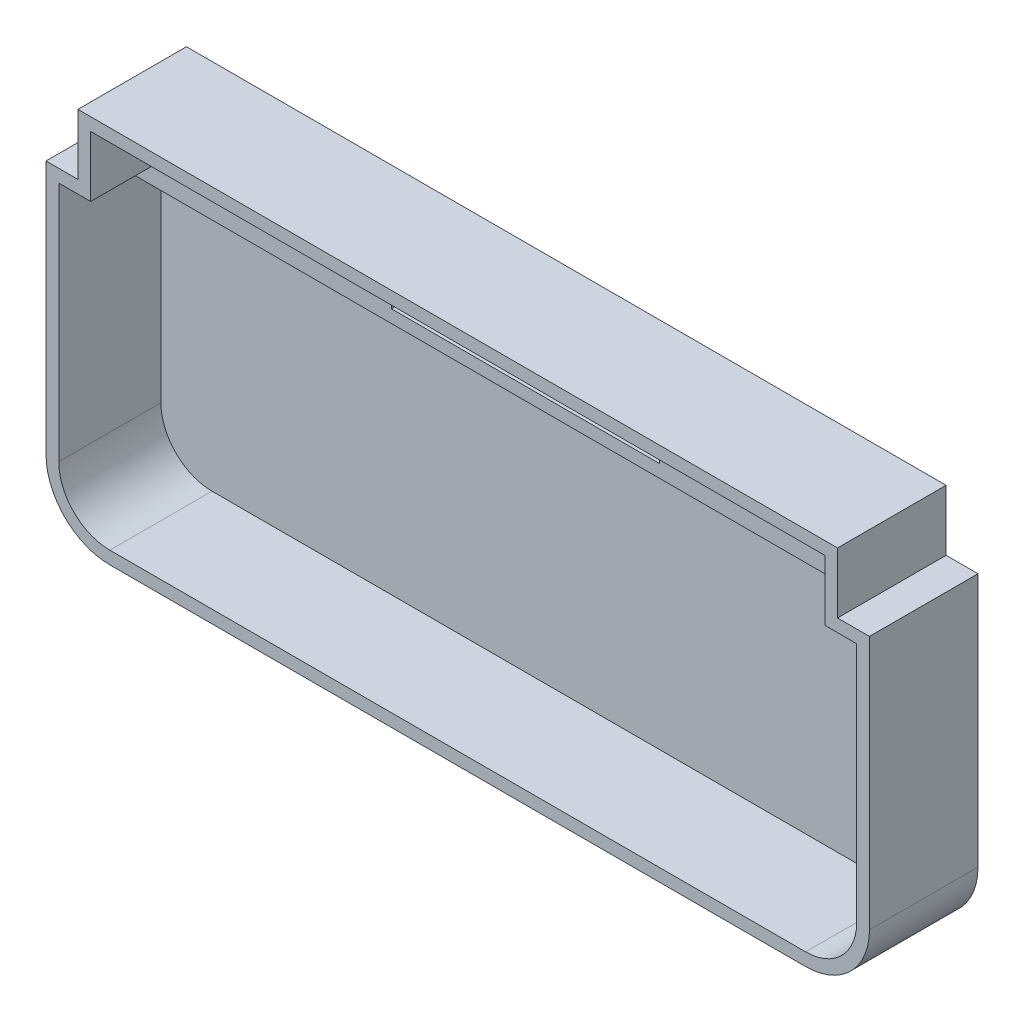
ISO-10303-21;
HEADER;
FILE_DESCRIPTION(('STEP AP214'),'2;1');
FILE_NAME('part.step','',(''),(''),'','','');
FILE_SCHEMA(('AUTOMOTIVE_DESIGN { 1 0 10303 214 1 1 1 1 }'));
ENDSEC;
DATA;
#1=APPLICATION_CONTEXT('core data for automotive mechanical design processes');
#2=APPLICATION_PROTOCOL_DEFINITION('international standard','automotive_design',2000,#1);
#3=PRODUCT_CONTEXT('',#1,'mechanical');
#4=PRODUCT('Part','Part','',(#3));
#5=PRODUCT_RELATED_PRODUCT_CATEGORY('part','',(#4));
#6=PRODUCT_DEFINITION_FORMATION('','',#4);
#7=PRODUCT_DEFINITION_CONTEXT('part definition',#1,'design');
#8=PRODUCT_DEFINITION('design','',#6,#7);
#9=PRODUCT_DEFINITION_SHAPE('','',#8);
#10=(LENGTH_UNIT() NAMED_UNIT(*) SI_UNIT(.MILLI.,.METRE.));
#11=(NAMED_UNIT(*) PLANE_ANGLE_UNIT() SI_UNIT($,.RADIAN.));
#12=(NAMED_UNIT(*) SI_UNIT($,.STERADIAN.) SOLID_ANGLE_UNIT());
#13=UNCERTAINTY_MEASURE_WITH_UNIT(LENGTH_MEASURE(1.E-05),#10,'distance_accuracy_value','');
#14=(GEOMETRIC_REPRESENTATION_CONTEXT(3) GLOBAL_UNCERTAINTY_ASSIGNED_CONTEXT((#13)) GLOBAL_UNIT_ASSIGNED_CONTEXT((#10,
#11,#12)) REPRESENTATION_CONTEXT('',''));
#15=CARTESIAN_POINT('',(0.,0.,0.));
#16=DIRECTION('',(0.,0.,1.));
#17=DIRECTION('',(1.,0.,0.));
#18=AXIS2_PLACEMENT_3D('',#15,#16,#17);
#19=CARTESIAN_POINT('',(62.5,-34.3,17.));
#20=DIRECTION('',(-1.,0.,0.));
#21=DIRECTION('',(0.,0.,1.));
#22=AXIS2_PLACEMENT_3D('',#19,#20,#21);
#23=PLANE('',#22);
#24=DIRECTION('',(0.,1.,0.));
#25=VECTOR('',#24,1.);
#26=CARTESIAN_POINT('',(62.5,3.5,6.5));
#27=LINE('',#26,#25);
#28=CARTESIAN_POINT('',(62.5,0.,6.5));
#29=VERTEX_POINT('',#28);
#30=CARTESIAN_POINT('',(62.5,3.5,6.5));
#31=VERTEX_POINT('',#30);
#32=EDGE_CURVE('E257',#29,#31,#27,.T.);
#33=ORIENTED_EDGE('',*,*,#32,.F.);
#34=DIRECTION('',(0.,0.,-1.));
#35=VECTOR('',#34,1.);
#36=CARTESIAN_POINT('',(62.5,0.,6.5));
#37=LINE('',#36,#35);
#38=CARTESIAN_POINT('',(62.5,0.,1.));
#39=VERTEX_POINT('',#38);
#40=EDGE_CURVE('E292',#29,#39,#37,.T.);
#41=ORIENTED_EDGE('',*,*,#40,.T.);
#42=DIRECTION('',(0.,1.,0.));
#43=VECTOR('',#42,1.);
#44=CARTESIAN_POINT('',(62.5,-34.3,1.));
#45=LINE('',#44,#43);
#46=CARTESIAN_POINT('',(62.5,-34.3,1.));
#47=VERTEX_POINT('',#46);
#48=EDGE_CURVE('E339',#47,#39,#45,.T.);
#49=ORIENTED_EDGE('',*,*,#48,.F.);
#50=DIRECTION('',(0.,0.,-1.));
#51=VECTOR('',#50,1.);
#52=CARTESIAN_POINT('',(62.5,-34.3,17.));
#53=LINE('',#52,#51);
#54=CARTESIAN_POINT('',(62.5,-34.3,17.));
#55=VERTEX_POINT('',#54);
#56=EDGE_CURVE('E373',#55,#47,#53,.T.);
#57=ORIENTED_EDGE('',*,*,#56,.F.);
#58=DIRECTION('',(0.,1.,0.));
#59=VECTOR('',#58,1.);
#60=CARTESIAN_POINT('',(62.5,-34.3,17.));
#61=LINE('',#60,#59);
#62=CARTESIAN_POINT('',(62.5,3.5,17.));
#63=VERTEX_POINT('',#62);
#64=EDGE_CURVE('E308',#55,#63,#61,.T.);
#65=ORIENTED_EDGE('',*,*,#64,.T.);
#66=DIRECTION('',(0.,0.,-1.));
#67=VECTOR('',#66,1.);
#68=CARTESIAN_POINT('',(62.5,3.5,17.));
#69=LINE('',#68,#67);
#70=EDGE_CURVE('E369',#63,#31,#69,.T.);
#71=ORIENTED_EDGE('',*,*,#70,.T.);
#72=EDGE_LOOP('',(#33,#41,#49,#57,#65,#71));
#73=FACE_BOUND('',#72,.T.);
#74=ADVANCED_FACE('F41',(#73),#23,.T.);
#75=CARTESIAN_POINT('',(62.5,3.5,17.));
#76=DIRECTION('',(0.,-1.,0.));
#77=DIRECTION('',(0.,0.,-1.));
#78=AXIS2_PLACEMENT_3D('',#75,#76,#77);
#79=PLANE('',#78);
#80=DIRECTION('',(0.,0.,-1.));
#81=VECTOR('',#80,1.);
#82=CARTESIAN_POINT('',(57.5,3.5,17.));
#83=LINE('',#82,#81);
#84=CARTESIAN_POINT('',(57.5,3.5,17.));
#85=VERTEX_POINT('',#84);
#86=CARTESIAN_POINT('',(57.5,3.5,6.5));
#87=VERTEX_POINT('',#86);
#88=EDGE_CURVE('E365',#85,#87,#83,.T.);
#89=ORIENTED_EDGE('',*,*,#88,.T.);
#90=DIRECTION('',(-1.,0.,0.));
#91=VECTOR('',#90,1.);
#92=CARTESIAN_POINT('',(57.5,3.5,6.5));
#93=LINE('',#92,#91);
#94=EDGE_CURVE('E260',#31,#87,#93,.T.);
#95=ORIENTED_EDGE('',*,*,#94,.F.);
#96=ORIENTED_EDGE('',*,*,#70,.F.);
#97=DIRECTION('',(-1.,0.,0.));
#98=VECTOR('',#97,1.);
#99=CARTESIAN_POINT('',(62.5,3.5,17.));
#100=LINE('',#99,#98);
#101=EDGE_CURVE('E311',#63,#85,#100,.T.);
#102=ORIENTED_EDGE('',*,*,#101,.T.);
#103=EDGE_LOOP('',(#89,#95,#96,#102));
#104=FACE_BOUND('',#103,.T.);
#105=ADVANCED_FACE('F541',(#104),#79,.T.);
#106=CARTESIAN_POINT('',(57.5,3.5,17.));
#107=DIRECTION('',(-1.,0.,0.));
#108=DIRECTION('',(0.,0.,1.));
#109=AXIS2_PLACEMENT_3D('',#106,#107,#108);
#110=PLANE('',#109);
#111=DIRECTION('',(0.,0.,-1.));
#112=VECTOR('',#111,1.);
#113=CARTESIAN_POINT('',(57.5,13.,17.));
#114=LINE('',#113,#112);
#115=CARTESIAN_POINT('',(57.5,13.,17.));
#116=VERTEX_POINT('',#115);
#117=CARTESIAN_POINT('',(57.5,13.,6.5));
#118=VERTEX_POINT('',#117);
#119=EDGE_CURVE('E361',#116,#118,#114,.T.);
#120=ORIENTED_EDGE('',*,*,#119,.T.);
#121=DIRECTION('',(0.,1.,0.));
#122=VECTOR('',#121,1.);
#123=CARTESIAN_POINT('',(57.5,13.,6.5));
#124=LINE('',#123,#122);
#125=EDGE_CURVE('E263',#87,#118,#124,.T.);
#126=ORIENTED_EDGE('',*,*,#125,.F.);
#127=ORIENTED_EDGE('',*,*,#88,.F.);
#128=DIRECTION('',(0.,1.,0.));
#129=VECTOR('',#128,1.);
#130=CARTESIAN_POINT('',(57.5,3.5,17.));
#131=LINE('',#130,#129);
#132=EDGE_CURVE('E314',#85,#116,#131,.T.);
#133=ORIENTED_EDGE('',*,*,#132,.T.);
#134=EDGE_LOOP('',(#120,#126,#127,#133));
#135=FACE_BOUND('',#134,.T.);
#136=ADVANCED_FACE('F547',(#135),#110,.T.);
#137=CARTESIAN_POINT('',(57.5,13.,17.));
#138=DIRECTION('',(0.,-1.,0.));
#139=DIRECTION('',(0.,0.,-1.));
#140=AXIS2_PLACEMENT_3D('',#137,#138,#139);
#141=PLANE('',#140);
#142=DIRECTION('',(-1.,0.,0.));
#143=VECTOR('',#142,1.);
#144=CARTESIAN_POINT('',(-57.5,13.,6.5));
#145=LINE('',#144,#143);
#146=CARTESIAN_POINT('',(-20.8775137039371,13.,6.5));
#147=VERTEX_POINT('',#146);
#148=CARTESIAN_POINT('',(-57.5,13.,6.5));
#149=VERTEX_POINT('',#148);
#150=EDGE_CURVE('E218',#147,#149,#145,.T.);
#151=ORIENTED_EDGE('',*,*,#150,.F.);
#152=DIRECTION('',(0.,0.,-1.));
#153=VECTOR('',#152,1.);
#154=CARTESIAN_POINT('',(-20.8775137039371,13.,6.5));
#155=LINE('',#154,#153);
#156=CARTESIAN_POINT('',(-20.8775137039371,13.,1.));
#157=VERTEX_POINT('',#156);
#158=EDGE_CURVE('E228',#147,#157,#155,.T.);
#159=ORIENTED_EDGE('',*,*,#158,.T.);
#160=DIRECTION('',(-1.,0.,0.));
#161=VECTOR('',#160,1.);
#162=CARTESIAN_POINT('',(57.5,13.,1.));
#163=LINE('',#162,#161);
#164=CARTESIAN_POINT('',(21.1224862960629,13.,1.));
#165=VERTEX_POINT('',#164);
#166=EDGE_CURVE('E343',#165,#157,#163,.T.);
#167=ORIENTED_EDGE('',*,*,#166,.F.);
#168=DIRECTION('',(0.,0.,-1.));
#169=VECTOR('',#168,1.);
#170=CARTESIAN_POINT('',(21.1224862960629,13.,6.5));
#171=LINE('',#170,#169);
#172=CARTESIAN_POINT('',(21.1224862960629,13.,6.5));
#173=VERTEX_POINT('',#172);
#174=EDGE_CURVE('E289',#173,#165,#171,.T.);
#175=ORIENTED_EDGE('',*,*,#174,.F.);
#176=DIRECTION('',(-1.,0.,0.));
#177=VECTOR('',#176,1.);
#178=CARTESIAN_POINT('',(21.1224862960629,13.,6.5));
#179=LINE('',#178,#177);
#180=EDGE_CURVE('E266',#118,#173,#179,.T.);
#181=ORIENTED_EDGE('',*,*,#180,.F.);
#182=ORIENTED_EDGE('',*,*,#119,.F.);
#183=DIRECTION('',(-1.,0.,0.));
#184=VECTOR('',#183,1.);
#185=CARTESIAN_POINT('',(57.5,13.,17.));
#186=LINE('',#185,#184);
#187=CARTESIAN_POINT('',(-57.5,13.,17.));
#188=VERTEX_POINT('',#187);
#189=EDGE_CURVE('E317',#116,#188,#186,.T.);
#190=ORIENTED_EDGE('',*,*,#189,.T.);
#191=DIRECTION('',(0.,0.,-1.));
#192=VECTOR('',#191,1.);
#193=CARTESIAN_POINT('',(-57.5,13.,17.));
#194=LINE('',#193,#192);
#195=EDGE_CURVE('E241',#188,#149,#194,.T.);
#196=ORIENTED_EDGE('',*,*,#195,.T.);
#197=EDGE_LOOP('',(#151,#159,#167,#175,#181,#182,#190,#196));
#198=FACE_BOUND('',#197,.T.);
#199=ADVANCED_FACE('F239',(#198),#141,.T.);
#200=CARTESIAN_POINT('',(-57.5,13.,17.));
#201=DIRECTION('',(1.,0.,0.));
#202=DIRECTION('',(0.,0.,-1.));
#203=AXIS2_PLACEMENT_3D('',#200,#201,#202);
#204=PLANE('',#203);
#205=DIRECTION('',(0.,0.,-1.));
#206=VECTOR('',#205,1.);
#207=CARTESIAN_POINT('',(-57.5,3.5,17.));
#208=LINE('',#207,#206);
#209=CARTESIAN_POINT('',(-57.5,3.5,17.));
#210=VERTEX_POINT('',#209);
#211=CARTESIAN_POINT('',(-57.5,3.5,6.5));
#212=VERTEX_POINT('',#211);
#213=EDGE_CURVE('E355',#210,#212,#208,.T.);
#214=ORIENTED_EDGE('',*,*,#213,.T.);
#215=DIRECTION('',(0.,-1.,0.));
#216=VECTOR('',#215,1.);
#217=CARTESIAN_POINT('',(-57.5,3.5,6.5));
#218=LINE('',#217,#216);
#219=EDGE_CURVE('E243',#149,#212,#218,.T.);
#220=ORIENTED_EDGE('',*,*,#219,.F.);
#221=ORIENTED_EDGE('',*,*,#195,.F.);
#222=DIRECTION('',(0.,-1.,0.));
#223=VECTOR('',#222,1.);
#224=CARTESIAN_POINT('',(-57.5,13.,17.));
#225=LINE('',#224,#223);
#226=EDGE_CURVE('E320',#188,#210,#225,.T.);
#227=ORIENTED_EDGE('',*,*,#226,.T.);
#228=EDGE_LOOP('',(#214,#220,#221,#227));
#229=FACE_BOUND('',#228,.T.);
#230=ADVANCED_FACE('F613',(#229),#204,.T.);
#231=CARTESIAN_POINT('',(-57.5,3.5,17.));
#232=DIRECTION('',(0.,-1.,0.));
#233=DIRECTION('',(0.,0.,-1.));
#234=AXIS2_PLACEMENT_3D('',#231,#232,#233);
#235=PLANE('',#234);
#236=DIRECTION('',(0.,0.,-1.));
#237=VECTOR('',#236,1.);
#238=CARTESIAN_POINT('',(-62.5,3.5,17.));
#239=LINE('',#238,#237);
#240=CARTESIAN_POINT('',(-62.5,3.5,17.));
#241=VERTEX_POINT('',#240);
#242=CARTESIAN_POINT('',(-62.5,3.5,6.5));
#243=VERTEX_POINT('',#242);
#244=EDGE_CURVE('E351',#241,#243,#239,.T.);
#245=ORIENTED_EDGE('',*,*,#244,.T.);
#246=DIRECTION('',(-1.,0.,0.));
#247=VECTOR('',#246,1.);
#248=CARTESIAN_POINT('',(-62.5,3.5,6.5));
#249=LINE('',#248,#247);
#250=EDGE_CURVE('E246',#212,#243,#249,.T.);
#251=ORIENTED_EDGE('',*,*,#250,.F.);
#252=ORIENTED_EDGE('',*,*,#213,.F.);
#253=DIRECTION('',(-1.,0.,0.));
#254=VECTOR('',#253,1.);
#255=CARTESIAN_POINT('',(-57.5,3.5,17.));
#256=LINE('',#255,#254);
#257=EDGE_CURVE('E323',#210,#241,#256,.T.);
#258=ORIENTED_EDGE('',*,*,#257,.T.);
#259=EDGE_LOOP('',(#245,#251,#252,#258));
#260=FACE_BOUND('',#259,.T.);
#261=ADVANCED_FACE('F619',(#260),#235,.T.);
#262=CARTESIAN_POINT('',(-62.5,3.5,17.));
#263=DIRECTION('',(1.,0.,0.));
#264=DIRECTION('',(0.,0.,-1.));
#265=AXIS2_PLACEMENT_3D('',#262,#263,#264);
#266=PLANE('',#265);
#267=DIRECTION('',(0.,-1.,0.));
#268=VECTOR('',#267,1.);
#269=CARTESIAN_POINT('',(-62.5,3.5,1.));
#270=LINE('',#269,#268);
#271=CARTESIAN_POINT('',(-62.5,0.,1.));
#272=VERTEX_POINT('',#271);
#273=CARTESIAN_POINT('',(-62.5,-34.3,1.));
#274=VERTEX_POINT('',#273);
#275=EDGE_CURVE('E302',#272,#274,#270,.T.);
#276=ORIENTED_EDGE('',*,*,#275,.F.);
#277=DIRECTION('',(0.,0.,-1.));
#278=VECTOR('',#277,1.);
#279=CARTESIAN_POINT('',(-62.5,0.,6.5));
#280=LINE('',#279,#278);
#281=CARTESIAN_POINT('',(-62.5,0.,6.5));
#282=VERTEX_POINT('',#281);
#283=EDGE_CURVE('E236',#282,#272,#280,.T.);
#284=ORIENTED_EDGE('',*,*,#283,.F.);
#285=DIRECTION('',(0.,-1.,0.));
#286=VECTOR('',#285,1.);
#287=CARTESIAN_POINT('',(-62.5,0.,6.5));
#288=LINE('',#287,#286);
#289=EDGE_CURVE('E251',#243,#282,#288,.T.);
#290=ORIENTED_EDGE('',*,*,#289,.F.);
#291=ORIENTED_EDGE('',*,*,#244,.F.);
#292=DIRECTION('',(0.,-1.,0.));
#293=VECTOR('',#292,1.);
#294=CARTESIAN_POINT('',(-62.5,3.5,17.));
#295=LINE('',#294,#293);
#296=CARTESIAN_POINT('',(-62.5,-34.3,17.));
#297=VERTEX_POINT('',#296);
#298=EDGE_CURVE('E327',#241,#297,#295,.T.);
#299=ORIENTED_EDGE('',*,*,#298,.T.);
#300=DIRECTION('',(0.,0.,-1.));
#301=VECTOR('',#300,1.);
#302=CARTESIAN_POINT('',(-62.5,-34.3,17.));
#303=LINE('',#302,#301);
#304=EDGE_CURVE('E330',#297,#274,#303,.T.);
#305=ORIENTED_EDGE('',*,*,#304,.T.);
#306=EDGE_LOOP('',(#276,#284,#290,#291,#299,#305));
#307=FACE_BOUND('',#306,.T.);
#308=ADVANCED_FACE('F568',(#307),#266,.T.);
#309=CARTESIAN_POINT('',(0.,0.,1.));
#310=DIRECTION('',(0.,0.,1.));
#311=DIRECTION('',(1.,0.,0.));
#312=AXIS2_PLACEMENT_3D('',#309,#310,#311);
#313=PLANE('',#312);
#314=ORIENTED_EDGE('',*,*,#48,.T.);
#315=DIRECTION('',(1.,0.,0.));
#316=VECTOR('',#315,1.);
#317=CARTESIAN_POINT('',(62.5,0.,1.));
#318=LINE('',#317,#316);
#319=EDGE_CURVE('E277',#272,#39,#318,.T.);
#320=ORIENTED_EDGE('',*,*,#319,.F.);
#321=ORIENTED_EDGE('',*,*,#275,.T.);
#322=CARTESIAN_POINT('',(-54.5,-34.3,1.));
#323=DIRECTION('',(0.,0.,1.));
#324=DIRECTION('',(1.,0.,0.));
#325=AXIS2_PLACEMENT_3D('',#322,#323,#324);
#326=CIRCLE('',#325,8.);
#327=CARTESIAN_POINT('',(-54.5,-42.3,1.));
#328=VERTEX_POINT('',#327);
#329=EDGE_CURVE('E65',#274,#328,#326,.T.);
#330=ORIENTED_EDGE('',*,*,#329,.T.);
#331=DIRECTION('',(1.,0.,0.));
#332=VECTOR('',#331,1.);
#333=CARTESIAN_POINT('',(-54.5,-42.3,1.));
#334=LINE('',#333,#332);
#335=CARTESIAN_POINT('',(54.5,-42.3,1.));
#336=VERTEX_POINT('',#335);
#337=EDGE_CURVE('E333',#328,#336,#334,.T.);
#338=ORIENTED_EDGE('',*,*,#337,.T.);
#339=CARTESIAN_POINT('',(54.5,-34.3,1.));
#340=DIRECTION('',(0.,0.,1.));
#341=DIRECTION('',(1.,0.,0.));
#342=AXIS2_PLACEMENT_3D('',#339,#340,#341);
#343=CIRCLE('',#342,8.);
#344=EDGE_CURVE('E336',#336,#47,#343,.T.);
#345=ORIENTED_EDGE('',*,*,#344,.T.);
#346=EDGE_LOOP('',(#314,#320,#321,#330,#338,#345));
#347=FACE_BOUND('',#346,.T.);
#348=ADVANCED_FACE('F564',(#347),#313,.T.);
#349=ORIENTED_EDGE('',*,*,#166,.T.);
#350=DIRECTION('',(0.,1.,0.));
#351=VECTOR('',#350,1.);
#352=CARTESIAN_POINT('',(-20.8775137039371,2.,1.));
#353=LINE('',#352,#351);
#354=CARTESIAN_POINT('',(-20.8775137039371,2.,1.));
#355=VERTEX_POINT('',#354);
#356=EDGE_CURVE('E231',#355,#157,#353,.T.);
#357=ORIENTED_EDGE('',*,*,#356,.F.);
#358=DIRECTION('',(-1.,0.,0.));
#359=VECTOR('',#358,1.);
#360=CARTESIAN_POINT('',(-20.8775137039371,2.,1.));
#361=LINE('',#360,#359);
#362=CARTESIAN_POINT('',(21.1224862960629,2.,1.));
#363=VERTEX_POINT('',#362);
#364=EDGE_CURVE('E225',#363,#355,#361,.T.);
#365=ORIENTED_EDGE('',*,*,#364,.F.);
#366=DIRECTION('',(0.,-1.,0.));
#367=VECTOR('',#366,1.);
#368=CARTESIAN_POINT('',(21.1224862960629,2.,1.));
#369=LINE('',#368,#367);
#370=EDGE_CURVE('E280',#165,#363,#369,.T.);
#371=ORIENTED_EDGE('',*,*,#370,.F.);
#372=EDGE_LOOP('',(#349,#357,#365,#371));
#373=FACE_BOUND('',#372,.T.);
#374=ADVANCED_FACE('F567',(#373),#313,.T.);
#375=CARTESIAN_POINT('',(59.5,15.,1.));
#376=DIRECTION('',(-1.,0.,0.));
#377=DIRECTION('',(0.,0.,1.));
#378=AXIS2_PLACEMENT_3D('',#375,#376,#377);
#379=PLANE('',#378);
#380=DIRECTION('',(0.,1.,0.));
#381=VECTOR('',#380,1.);
#382=CARTESIAN_POINT('',(59.5,15.,0.));
#383=LINE('',#382,#381);
#384=CARTESIAN_POINT('',(59.5,5.5,0.));
#385=VERTEX_POINT('',#384);
#386=CARTESIAN_POINT('',(59.5,15.,0.));
#387=VERTEX_POINT('',#386);
#388=EDGE_CURVE('E425',#385,#387,#383,.T.);
#389=ORIENTED_EDGE('',*,*,#388,.T.);
#390=DIRECTION('',(0.,0.,-1.));
#391=VECTOR('',#390,1.);
#392=CARTESIAN_POINT('',(59.5,15.,1.));
#393=LINE('',#392,#391);
#394=CARTESIAN_POINT('',(59.5,15.,17.));
#395=VERTEX_POINT('',#394);
#396=EDGE_CURVE('E472',#395,#387,#393,.T.);
#397=ORIENTED_EDGE('',*,*,#396,.F.);
#398=DIRECTION('',(0.,1.,0.));
#399=VECTOR('',#398,1.);
#400=CARTESIAN_POINT('',(59.5,5.5,17.));
#401=LINE('',#400,#399);
#402=CARTESIAN_POINT('',(59.5,5.5,17.));
#403=VERTEX_POINT('',#402);
#404=EDGE_CURVE('E389',#403,#395,#401,.T.);
#405=ORIENTED_EDGE('',*,*,#404,.F.);
#406=DIRECTION('',(0.,0.,-1.));
#407=VECTOR('',#406,1.);
#408=CARTESIAN_POINT('',(59.5,5.5,1.));
#409=LINE('',#408,#407);
#410=EDGE_CURVE('E452',#403,#385,#409,.T.);
#411=ORIENTED_EDGE('',*,*,#410,.T.);
#412=EDGE_LOOP('',(#389,#397,#405,#411));
#413=FACE_BOUND('',#412,.T.);
#414=ADVANCED_FACE('F515',(#413),#379,.F.);
#415=CARTESIAN_POINT('',(-59.5,15.,1.));
#416=DIRECTION('',(0.,-1.,0.));
#417=DIRECTION('',(0.,0.,-1.));
#418=AXIS2_PLACEMENT_3D('',#415,#416,#417);
#419=PLANE('',#418);
#420=DIRECTION('',(-1.,0.,0.));
#421=VECTOR('',#420,1.);
#422=CARTESIAN_POINT('',(-59.5,15.,0.));
#423=LINE('',#422,#421);
#424=CARTESIAN_POINT('',(-59.5,15.,0.));
#425=VERTEX_POINT('',#424);
#426=EDGE_CURVE('E429',#387,#425,#423,.T.);
#427=ORIENTED_EDGE('',*,*,#426,.T.);
#428=DIRECTION('',(0.,0.,-1.));
#429=VECTOR('',#428,1.);
#430=CARTESIAN_POINT('',(-59.5,15.,1.));
#431=LINE('',#430,#429);
#432=CARTESIAN_POINT('',(-59.5,15.,17.));
#433=VERTEX_POINT('',#432);
#434=EDGE_CURVE('E468',#433,#425,#431,.T.);
#435=ORIENTED_EDGE('',*,*,#434,.F.);
#436=DIRECTION('',(-1.,0.,0.));
#437=VECTOR('',#436,1.);
#438=CARTESIAN_POINT('',(59.5,15.,17.));
#439=LINE('',#438,#437);
#440=EDGE_CURVE('E393',#395,#433,#439,.T.);
#441=ORIENTED_EDGE('',*,*,#440,.F.);
#442=ORIENTED_EDGE('',*,*,#396,.T.);
#443=EDGE_LOOP('',(#427,#435,#441,#442));
#444=FACE_BOUND('',#443,.T.);
#445=ADVANCED_FACE('F519',(#444),#419,.F.);
#446=CARTESIAN_POINT('',(-59.5,5.5,1.));
#447=DIRECTION('',(1.,0.,0.));
#448=DIRECTION('',(0.,0.,-1.));
#449=AXIS2_PLACEMENT_3D('',#446,#447,#448);
#450=PLANE('',#449);
#451=DIRECTION('',(0.,-1.,0.));
#452=VECTOR('',#451,1.);
#453=CARTESIAN_POINT('',(-59.5,5.5,0.));
#454=LINE('',#453,#452);
#455=CARTESIAN_POINT('',(-59.5,5.5,0.));
#456=VERTEX_POINT('',#455);
#457=EDGE_CURVE('E432',#425,#456,#454,.T.);
#458=ORIENTED_EDGE('',*,*,#457,.T.);
#459=DIRECTION('',(0.,0.,-1.));
#460=VECTOR('',#459,1.);
#461=CARTESIAN_POINT('',(-59.5,5.5,1.));
#462=LINE('',#461,#460);
#463=CARTESIAN_POINT('',(-59.5,5.5,17.));
#464=VERTEX_POINT('',#463);
#465=EDGE_CURVE('E464',#464,#456,#462,.T.);
#466=ORIENTED_EDGE('',*,*,#465,.F.);
#467=DIRECTION('',(0.,-1.,0.));
#468=VECTOR('',#467,1.);
#469=CARTESIAN_POINT('',(-59.5,15.,17.));
#470=LINE('',#469,#468);
#471=EDGE_CURVE('E397',#433,#464,#470,.T.);
#472=ORIENTED_EDGE('',*,*,#471,.F.);
#473=ORIENTED_EDGE('',*,*,#434,.T.);
#474=EDGE_LOOP('',(#458,#466,#472,#473));
#475=FACE_BOUND('',#474,.T.);
#476=ADVANCED_FACE('F522',(#475),#450,.F.);
#477=CARTESIAN_POINT('',(-64.5,5.5,1.));
#478=DIRECTION('',(0.,-1.,0.));
#479=DIRECTION('',(0.,0.,-1.));
#480=AXIS2_PLACEMENT_3D('',#477,#478,#479);
#481=PLANE('',#480);
#482=DIRECTION('',(-1.,0.,0.));
#483=VECTOR('',#482,1.);
#484=CARTESIAN_POINT('',(-64.5,5.5,0.));
#485=LINE('',#484,#483);
#486=CARTESIAN_POINT('',(-64.5,5.5,0.));
#487=VERTEX_POINT('',#486);
#488=EDGE_CURVE('E435',#456,#487,#485,.T.);
#489=ORIENTED_EDGE('',*,*,#488,.T.);
#490=DIRECTION('',(0.,0.,-1.));
#491=VECTOR('',#490,1.);
#492=CARTESIAN_POINT('',(-64.5,5.5,1.));
#493=LINE('',#492,#491);
#494=CARTESIAN_POINT('',(-64.5,5.5,17.));
#495=VERTEX_POINT('',#494);
#496=EDGE_CURVE('E460',#495,#487,#493,.T.);
#497=ORIENTED_EDGE('',*,*,#496,.F.);
#498=DIRECTION('',(-1.,0.,0.));
#499=VECTOR('',#498,1.);
#500=CARTESIAN_POINT('',(-59.5,5.5,17.));
#501=LINE('',#500,#499);
#502=EDGE_CURVE('E401',#464,#495,#501,.T.);
#503=ORIENTED_EDGE('',*,*,#502,.F.);
#504=ORIENTED_EDGE('',*,*,#465,.T.);
#505=EDGE_LOOP('',(#489,#497,#503,#504));
#506=FACE_BOUND('',#505,.T.);
#507=ADVANCED_FACE('F526',(#506),#481,.F.);
#508=CARTESIAN_POINT('',(-64.5,-44.3,1.));
#509=DIRECTION('',(1.,0.,0.));
#510=DIRECTION('',(0.,0.,-1.));
#511=AXIS2_PLACEMENT_3D('',#508,#509,#510);
#512=PLANE('',#511);
#513=DIRECTION('',(0.,-1.,0.));
#514=VECTOR('',#513,1.);
#515=CARTESIAN_POINT('',(-64.5,-44.3,0.));
#516=LINE('',#515,#514);
#517=CARTESIAN_POINT('',(-64.5,-34.3,0.));
#518=VERTEX_POINT('',#517);
#519=EDGE_CURVE('E438',#487,#518,#516,.T.);
#520=ORIENTED_EDGE('',*,*,#519,.T.);
#521=DIRECTION('',(0.,0.,-1.));
#522=VECTOR('',#521,1.);
#523=CARTESIAN_POINT('',(-64.5,-34.3,1.));
#524=LINE('',#523,#522);
#525=CARTESIAN_POINT('',(-64.5,-34.3,17.));
#526=VERTEX_POINT('',#525);
#527=EDGE_CURVE('E11',#518,#526,#524,.F.);
#528=ORIENTED_EDGE('',*,*,#527,.T.);
#529=DIRECTION('',(0.,-1.,0.));
#530=VECTOR('',#529,1.);
#531=CARTESIAN_POINT('',(-64.5,5.5,17.));
#532=LINE('',#531,#530);
#533=EDGE_CURVE('E405',#495,#526,#532,.T.);
#534=ORIENTED_EDGE('',*,*,#533,.F.);
#535=ORIENTED_EDGE('',*,*,#496,.T.);
#536=EDGE_LOOP('',(#520,#528,#534,#535));
#537=FACE_BOUND('',#536,.T.);
#538=ADVANCED_FACE('F530',(#537),#512,.F.);
#539=CARTESIAN_POINT('',(64.5,-44.3,1.));
#540=DIRECTION('',(0.,1.,0.));
#541=DIRECTION('',(-1.,0.,0.));
#542=AXIS2_PLACEMENT_3D('',#539,#540,#541);
#543=PLANE('',#542);
#544=DIRECTION('',(1.,0.,0.));
#545=VECTOR('',#544,1.);
#546=CARTESIAN_POINT('',(64.5,-44.3,0.));
#547=LINE('',#546,#545);
#548=CARTESIAN_POINT('',(-54.5,-44.3,0.));
#549=VERTEX_POINT('',#548);
#550=CARTESIAN_POINT('',(54.5,-44.3,0.));
#551=VERTEX_POINT('',#550);
#552=EDGE_CURVE('E442',#549,#551,#547,.T.);
#553=ORIENTED_EDGE('',*,*,#552,.T.);
#554=DIRECTION('',(0.,0.,-1.));
#555=VECTOR('',#554,1.);
#556=CARTESIAN_POINT('',(54.5,-44.3,1.));
#557=LINE('',#556,#555);
#558=CARTESIAN_POINT('',(54.5,-44.3,17.));
#559=VERTEX_POINT('',#558);
#560=EDGE_CURVE('E50',#551,#559,#557,.F.);
#561=ORIENTED_EDGE('',*,*,#560,.T.);
#562=DIRECTION('',(1.,0.,0.));
#563=VECTOR('',#562,1.);
#564=CARTESIAN_POINT('',(-54.5,-44.3,17.));
#565=LINE('',#564,#563);
#566=CARTESIAN_POINT('',(-54.5,-44.3,17.));
#567=VERTEX_POINT('',#566);
#568=EDGE_CURVE('E413',#567,#559,#565,.T.);
#569=ORIENTED_EDGE('',*,*,#568,.F.);
#570=DIRECTION('',(0.,0.,-1.));
#571=VECTOR('',#570,1.);
#572=CARTESIAN_POINT('',(-54.5,-44.3,1.));
#573=LINE('',#572,#571);
#574=EDGE_CURVE('E486',#567,#549,#573,.T.);
#575=ORIENTED_EDGE('',*,*,#574,.T.);
#576=EDGE_LOOP('',(#553,#561,#569,#575));
#577=FACE_BOUND('',#576,.T.);
#578=ADVANCED_FACE('F493',(#577),#543,.F.);
#579=CARTESIAN_POINT('',(64.5,5.5,1.));
#580=DIRECTION('',(-1.,0.,0.));
#581=DIRECTION('',(0.,0.,1.));
#582=AXIS2_PLACEMENT_3D('',#579,#580,#581);
#583=PLANE('',#582);
#584=DIRECTION('',(0.,0.,-1.));
#585=VECTOR('',#584,1.);
#586=CARTESIAN_POINT('',(64.5,5.5,1.));
#587=LINE('',#586,#585);
#588=CARTESIAN_POINT('',(64.5,5.5,17.));
#589=VERTEX_POINT('',#588);
#590=CARTESIAN_POINT('',(64.5,5.5,0.));
#591=VERTEX_POINT('',#590);
#592=EDGE_CURVE('E456',#589,#591,#587,.T.);
#593=ORIENTED_EDGE('',*,*,#592,.F.);
#594=DIRECTION('',(0.,1.,0.));
#595=VECTOR('',#594,1.);
#596=CARTESIAN_POINT('',(64.5,-34.3,17.));
#597=LINE('',#596,#595);
#598=CARTESIAN_POINT('',(64.5,-34.3,17.));
#599=VERTEX_POINT('',#598);
#600=EDGE_CURVE('E421',#599,#589,#597,.T.);
#601=ORIENTED_EDGE('',*,*,#600,.F.);
#602=DIRECTION('',(0.,0.,-1.));
#603=VECTOR('',#602,1.);
#604=CARTESIAN_POINT('',(64.5,-34.3,1.));
#605=LINE('',#604,#603);
#606=CARTESIAN_POINT('',(64.5,-34.3,0.));
#607=VERTEX_POINT('',#606);
#608=EDGE_CURVE('E476',#599,#607,#605,.T.);
#609=ORIENTED_EDGE('',*,*,#608,.T.);
#610=DIRECTION('',(0.,1.,0.));
#611=VECTOR('',#610,1.);
#612=CARTESIAN_POINT('',(64.5,5.5,0.));
#613=LINE('',#612,#611);
#614=EDGE_CURVE('E446',#607,#591,#613,.T.);
#615=ORIENTED_EDGE('',*,*,#614,.T.);
#616=EDGE_LOOP('',(#593,#601,#609,#615));
#617=FACE_BOUND('',#616,.T.);
#618=ADVANCED_FACE('F505',(#617),#583,.F.);
#619=CARTESIAN_POINT('',(59.5,5.5,1.));
#620=DIRECTION('',(0.,-1.,0.));
#621=DIRECTION('',(0.,0.,-1.));
#622=AXIS2_PLACEMENT_3D('',#619,#620,#621);
#623=PLANE('',#622);
#624=DIRECTION('',(-1.,0.,0.));
#625=VECTOR('',#624,1.);
#626=CARTESIAN_POINT('',(59.5,5.5,0.));
#627=LINE('',#626,#625);
#628=EDGE_CURVE('E449',#591,#385,#627,.T.);
#629=ORIENTED_EDGE('',*,*,#628,.T.);
#630=ORIENTED_EDGE('',*,*,#410,.F.);
#631=DIRECTION('',(-1.,0.,0.));
#632=VECTOR('',#631,1.);
#633=CARTESIAN_POINT('',(64.5,5.5,17.));
#634=LINE('',#633,#632);
#635=EDGE_CURVE('E385',#589,#403,#634,.T.);
#636=ORIENTED_EDGE('',*,*,#635,.F.);
#637=ORIENTED_EDGE('',*,*,#592,.T.);
#638=EDGE_LOOP('',(#629,#630,#636,#637));
#639=FACE_BOUND('',#638,.T.);
#640=ADVANCED_FACE('F511',(#639),#623,.F.);
#641=CARTESIAN_POINT('',(0.,0.,0.));
#642=DIRECTION('',(0.,0.,1.));
#643=DIRECTION('',(1.,0.,0.));
#644=AXIS2_PLACEMENT_3D('',#641,#642,#643);
#645=PLANE('',#644);
#646=ORIENTED_EDGE('',*,*,#614,.F.);
#647=CARTESIAN_POINT('',(54.5,-34.3,0.));
#648=DIRECTION('',(0.,0.,1.));
#649=DIRECTION('',(1.,0.,0.));
#650=AXIS2_PLACEMENT_3D('',#647,#648,#649);
#651=CIRCLE('',#650,10.);
#652=EDGE_CURVE('E483',#607,#551,#651,.F.);
#653=ORIENTED_EDGE('',*,*,#652,.T.);
#654=ORIENTED_EDGE('',*,*,#552,.F.);
#655=CARTESIAN_POINT('',(-54.5,-34.3,0.));
#656=DIRECTION('',(0.,0.,1.));
#657=DIRECTION('',(1.,0.,0.));
#658=AXIS2_PLACEMENT_3D('',#655,#656,#657);
#659=CIRCLE('',#658,10.);
#660=EDGE_CURVE('E480',#549,#518,#659,.F.);
#661=ORIENTED_EDGE('',*,*,#660,.T.);
#662=ORIENTED_EDGE('',*,*,#519,.F.);
#663=ORIENTED_EDGE('',*,*,#488,.F.);
#664=ORIENTED_EDGE('',*,*,#457,.F.);
#665=ORIENTED_EDGE('',*,*,#426,.F.);
#666=ORIENTED_EDGE('',*,*,#388,.F.);
#667=ORIENTED_EDGE('',*,*,#628,.F.);
#668=EDGE_LOOP('',(#646,#653,#654,#661,#662,#663,#664,#665,#666,#667));
#669=FACE_BOUND('',#668,.T.);
#670=ADVANCED_FACE('F508',(#669),#645,.F.);
#671=CARTESIAN_POINT('',(54.5,-34.3,1.));
#672=DIRECTION('',(0.,0.,-1.));
#673=DIRECTION('',(-1.,0.,0.));
#674=AXIS2_PLACEMENT_3D('',#671,#672,#673);
#675=CYLINDRICAL_SURFACE('',#674,10.);
#676=ORIENTED_EDGE('',*,*,#608,.F.);
#677=CARTESIAN_POINT('',(54.5,-34.3,17.));
#678=DIRECTION('',(0.,0.,1.));
#679=DIRECTION('',(1.,0.,0.));
#680=AXIS2_PLACEMENT_3D('',#677,#678,#679);
#681=CIRCLE('',#680,10.);
#682=EDGE_CURVE('E417',#559,#599,#681,.T.);
#683=ORIENTED_EDGE('',*,*,#682,.F.);
#684=ORIENTED_EDGE('',*,*,#560,.F.);
#685=ORIENTED_EDGE('',*,*,#652,.F.);
#686=EDGE_LOOP('',(#676,#683,#684,#685));
#687=FACE_BOUND('',#686,.T.);
#688=ADVANCED_FACE('F502',(#687),#675,.T.);
#689=CARTESIAN_POINT('',(-54.5,-34.3,1.));
#690=DIRECTION('',(0.,0.,-1.));
#691=DIRECTION('',(-1.,0.,0.));
#692=AXIS2_PLACEMENT_3D('',#689,#690,#691);
#693=CYLINDRICAL_SURFACE('',#692,10.);
#694=ORIENTED_EDGE('',*,*,#574,.F.);
#695=CARTESIAN_POINT('',(-54.5,-34.3,17.));
#696=DIRECTION('',(0.,0.,1.));
#697=DIRECTION('',(1.,0.,0.));
#698=AXIS2_PLACEMENT_3D('',#695,#696,#697);
#699=CIRCLE('',#698,10.);
#700=EDGE_CURVE('E409',#526,#567,#699,.T.);
#701=ORIENTED_EDGE('',*,*,#700,.F.);
#702=ORIENTED_EDGE('',*,*,#527,.F.);
#703=ORIENTED_EDGE('',*,*,#660,.F.);
#704=EDGE_LOOP('',(#694,#701,#702,#703));
#705=FACE_BOUND('',#704,.T.);
#706=ADVANCED_FACE('F43',(#705),#693,.T.);
#707=CARTESIAN_POINT('',(-54.5,-34.3,17.));
#708=DIRECTION('',(0.,0.,1.));
#709=DIRECTION('',(1.,0.,0.));
#710=AXIS2_PLACEMENT_3D('',#707,#708,#709);
#711=PLANE('',#710);
#712=ORIENTED_EDGE('',*,*,#635,.T.);
#713=ORIENTED_EDGE('',*,*,#404,.T.);
#714=ORIENTED_EDGE('',*,*,#440,.T.);
#715=ORIENTED_EDGE('',*,*,#471,.T.);
#716=ORIENTED_EDGE('',*,*,#502,.T.);
#717=ORIENTED_EDGE('',*,*,#533,.T.);
#718=ORIENTED_EDGE('',*,*,#700,.T.);
#719=ORIENTED_EDGE('',*,*,#568,.T.);
#720=ORIENTED_EDGE('',*,*,#682,.T.);
#721=ORIENTED_EDGE('',*,*,#600,.T.);
#722=EDGE_LOOP('',(#712,#713,#714,#715,#716,#717,#718,#719,#720,#721));
#723=FACE_BOUND('',#722,.T.);
#724=DIRECTION('',(1.,0.,0.));
#725=VECTOR('',#724,1.);
#726=CARTESIAN_POINT('',(-54.5,-42.3,17.));
#727=LINE('',#726,#725);
#728=CARTESIAN_POINT('',(-54.5,-42.3,17.));
#729=VERTEX_POINT('',#728);
#730=CARTESIAN_POINT('',(54.5,-42.3,17.));
#731=VERTEX_POINT('',#730);
#732=EDGE_CURVE('E301',#729,#731,#727,.T.);
#733=ORIENTED_EDGE('',*,*,#732,.F.);
#734=CARTESIAN_POINT('',(-54.5,-34.3,17.));
#735=DIRECTION('',(0.,0.,1.));
#736=DIRECTION('',(1.,0.,0.));
#737=AXIS2_PLACEMENT_3D('',#734,#735,#736);
#738=CIRCLE('',#737,8.);
#739=EDGE_CURVE('E298',#297,#729,#738,.T.);
#740=ORIENTED_EDGE('',*,*,#739,.F.);
#741=ORIENTED_EDGE('',*,*,#298,.F.);
#742=ORIENTED_EDGE('',*,*,#257,.F.);
#743=ORIENTED_EDGE('',*,*,#226,.F.);
#744=ORIENTED_EDGE('',*,*,#189,.F.);
#745=ORIENTED_EDGE('',*,*,#132,.F.);
#746=ORIENTED_EDGE('',*,*,#101,.F.);
#747=ORIENTED_EDGE('',*,*,#64,.F.);
#748=CARTESIAN_POINT('',(54.5,-34.3,17.));
#749=DIRECTION('',(0.,0.,1.));
#750=DIRECTION('',(1.,0.,0.));
#751=AXIS2_PLACEMENT_3D('',#748,#749,#750);
#752=CIRCLE('',#751,8.);
#753=EDGE_CURVE('E305',#731,#55,#752,.T.);
#754=ORIENTED_EDGE('',*,*,#753,.F.);
#755=EDGE_LOOP('',(#733,#740,#741,#742,#743,#744,#745,#746,#747,#754));
#756=FACE_BOUND('',#755,.T.);
#757=ADVANCED_FACE('F498',(#723,#756),#711,.T.);
#758=CARTESIAN_POINT('',(-54.5,-34.3,17.));
#759=DIRECTION('',(0.,0.,-1.));
#760=DIRECTION('',(-1.,0.,0.));
#761=AXIS2_PLACEMENT_3D('',#758,#759,#760);
#762=CYLINDRICAL_SURFACE('',#761,8.);
#763=ORIENTED_EDGE('',*,*,#329,.F.);
#764=ORIENTED_EDGE('',*,*,#304,.F.);
#765=ORIENTED_EDGE('',*,*,#739,.T.);
#766=DIRECTION('',(0.,0.,-1.));
#767=VECTOR('',#766,1.);
#768=CARTESIAN_POINT('',(-54.5,-42.3,17.));
#769=LINE('',#768,#767);
#770=EDGE_CURVE('E381',#729,#328,#769,.T.);
#771=ORIENTED_EDGE('',*,*,#770,.T.);
#772=EDGE_LOOP('',(#763,#764,#765,#771));
#773=FACE_BOUND('',#772,.T.);
#774=ADVANCED_FACE('F538',(#773),#762,.F.);
#775=CARTESIAN_POINT('',(-54.5,-42.3,17.));
#776=DIRECTION('',(0.,1.,0.));
#777=DIRECTION('',(-1.,0.,0.));
#778=AXIS2_PLACEMENT_3D('',#775,#776,#777);
#779=PLANE('',#778);
#780=ORIENTED_EDGE('',*,*,#337,.F.);
#781=ORIENTED_EDGE('',*,*,#770,.F.);
#782=ORIENTED_EDGE('',*,*,#732,.T.);
#783=DIRECTION('',(0.,0.,-1.));
#784=VECTOR('',#783,1.);
#785=CARTESIAN_POINT('',(54.5,-42.3,17.));
#786=LINE('',#785,#784);
#787=EDGE_CURVE('E377',#731,#336,#786,.T.);
#788=ORIENTED_EDGE('',*,*,#787,.T.);
#789=EDGE_LOOP('',(#780,#781,#782,#788));
#790=FACE_BOUND('',#789,.T.);
#791=ADVANCED_FACE('F556',(#790),#779,.T.);
#792=CARTESIAN_POINT('',(54.5,-34.3,17.));
#793=DIRECTION('',(0.,0.,-1.));
#794=DIRECTION('',(-1.,0.,0.));
#795=AXIS2_PLACEMENT_3D('',#792,#793,#794);
#796=CYLINDRICAL_SURFACE('',#795,8.);
#797=ORIENTED_EDGE('',*,*,#344,.F.);
#798=ORIENTED_EDGE('',*,*,#787,.F.);
#799=ORIENTED_EDGE('',*,*,#753,.T.);
#800=ORIENTED_EDGE('',*,*,#56,.T.);
#801=EDGE_LOOP('',(#797,#798,#799,#800));
#802=FACE_BOUND('',#801,.T.);
#803=ADVANCED_FACE('F553',(#802),#796,.F.);
#804=CARTESIAN_POINT('',(-20.8775137039371,2.,6.5));
#805=DIRECTION('',(-1.,0.,0.));
#806=DIRECTION('',(0.,0.,1.));
#807=AXIS2_PLACEMENT_3D('',#804,#805,#806);
#808=PLANE('',#807);
#809=ORIENTED_EDGE('',*,*,#356,.T.);
#810=ORIENTED_EDGE('',*,*,#158,.F.);
#811=DIRECTION('',(0.,1.,0.));
#812=VECTOR('',#811,1.);
#813=CARTESIAN_POINT('',(-20.8775137039371,2.,6.5));
#814=LINE('',#813,#812);
#815=CARTESIAN_POINT('',(-20.8775137039371,2.,6.5));
#816=VERTEX_POINT('',#815);
#817=EDGE_CURVE('E214',#816,#147,#814,.T.);
#818=ORIENTED_EDGE('',*,*,#817,.F.);
#819=DIRECTION('',(0.,0.,-1.));
#820=VECTOR('',#819,1.);
#821=CARTESIAN_POINT('',(-20.8775137039371,2.,6.5));
#822=LINE('',#821,#820);
#823=EDGE_CURVE('E274',#816,#355,#822,.T.);
#824=ORIENTED_EDGE('',*,*,#823,.T.);
#825=EDGE_LOOP('',(#809,#810,#818,#824));
#826=FACE_BOUND('',#825,.T.);
#827=ADVANCED_FACE('F229',(#826),#808,.F.);
#828=CARTESIAN_POINT('',(62.5,0.,6.5));
#829=DIRECTION('',(0.,1.,0.));
#830=DIRECTION('',(0.,0.,1.));
#831=AXIS2_PLACEMENT_3D('',#828,#829,#830);
#832=PLANE('',#831);
#833=ORIENTED_EDGE('',*,*,#319,.T.);
#834=ORIENTED_EDGE('',*,*,#40,.F.);
#835=DIRECTION('',(1.,0.,0.));
#836=VECTOR('',#835,1.);
#837=CARTESIAN_POINT('',(62.5,0.,6.5));
#838=LINE('',#837,#836);
#839=EDGE_CURVE('E254',#282,#29,#838,.T.);
#840=ORIENTED_EDGE('',*,*,#839,.F.);
#841=ORIENTED_EDGE('',*,*,#283,.T.);
#842=EDGE_LOOP('',(#833,#834,#840,#841));
#843=FACE_BOUND('',#842,.T.);
#844=ADVANCED_FACE('F628',(#843),#832,.F.);
#845=CARTESIAN_POINT('',(21.1224862960629,2.,6.5));
#846=DIRECTION('',(1.,0.,0.));
#847=DIRECTION('',(0.,0.,-1.));
#848=AXIS2_PLACEMENT_3D('',#845,#846,#847);
#849=PLANE('',#848);
#850=ORIENTED_EDGE('',*,*,#370,.T.);
#851=DIRECTION('',(0.,0.,-1.));
#852=VECTOR('',#851,1.);
#853=CARTESIAN_POINT('',(21.1224862960629,2.,6.5));
#854=LINE('',#853,#852);
#855=CARTESIAN_POINT('',(21.1224862960629,2.,6.5));
#856=VERTEX_POINT('',#855);
#857=EDGE_CURVE('E57',#856,#363,#854,.T.);
#858=ORIENTED_EDGE('',*,*,#857,.F.);
#859=DIRECTION('',(0.,-1.,0.));
#860=VECTOR('',#859,1.);
#861=CARTESIAN_POINT('',(21.1224862960629,2.,6.5));
#862=LINE('',#861,#860);
#863=EDGE_CURVE('E269',#173,#856,#862,.T.);
#864=ORIENTED_EDGE('',*,*,#863,.F.);
#865=ORIENTED_EDGE('',*,*,#174,.T.);
#866=EDGE_LOOP('',(#850,#858,#864,#865));
#867=FACE_BOUND('',#866,.T.);
#868=ADVANCED_FACE('F599',(#867),#849,.F.);
#869=CARTESIAN_POINT('',(-20.8775137039371,2.,6.5));
#870=DIRECTION('',(0.,-1.,0.));
#871=DIRECTION('',(0.,0.,-1.));
#872=AXIS2_PLACEMENT_3D('',#869,#870,#871);
#873=PLANE('',#872);
#874=ORIENTED_EDGE('',*,*,#364,.T.);
#875=ORIENTED_EDGE('',*,*,#823,.F.);
#876=DIRECTION('',(-1.,0.,0.));
#877=VECTOR('',#876,1.);
#878=CARTESIAN_POINT('',(-20.8775137039371,2.,6.5));
#879=LINE('',#878,#877);
#880=EDGE_CURVE('E220',#856,#816,#879,.T.);
#881=ORIENTED_EDGE('',*,*,#880,.F.);
#882=ORIENTED_EDGE('',*,*,#857,.T.);
#883=EDGE_LOOP('',(#874,#875,#881,#882));
#884=FACE_BOUND('',#883,.T.);
#885=ADVANCED_FACE('F642',(#884),#873,.F.);
#886=CARTESIAN_POINT('',(0.,0.,6.5));
#887=DIRECTION('',(0.,0.,-1.));
#888=DIRECTION('',(-1.,0.,0.));
#889=AXIS2_PLACEMENT_3D('',#886,#887,#888);
#890=PLANE('',#889);
#891=ORIENTED_EDGE('',*,*,#817,.T.);
#892=ORIENTED_EDGE('',*,*,#150,.T.);
#893=ORIENTED_EDGE('',*,*,#219,.T.);
#894=ORIENTED_EDGE('',*,*,#250,.T.);
#895=ORIENTED_EDGE('',*,*,#289,.T.);
#896=ORIENTED_EDGE('',*,*,#839,.T.);
#897=ORIENTED_EDGE('',*,*,#32,.T.);
#898=ORIENTED_EDGE('',*,*,#94,.T.);
#899=ORIENTED_EDGE('',*,*,#125,.T.);
#900=ORIENTED_EDGE('',*,*,#180,.T.);
#901=ORIENTED_EDGE('',*,*,#863,.T.);
#902=ORIENTED_EDGE('',*,*,#880,.T.);
#903=EDGE_LOOP('',(#891,#892,#893,#894,#895,#896,#897,#898,#899,#900,#901,#902));
#904=FACE_BOUND('',#903,.T.);
#905=ADVANCED_FACE('F216',(#904),#890,.F.);
#906=CLOSED_SHELL('',(#74,#105,#136,#199,#230,#261,#308,#348,#374,#414,#445,#476,#507,#538,#578,
#618,#640,#670,#688,#706,#757,#774,#791,#803,#827,#844,#868,#885,#905));
#907=MANIFOLD_SOLID_BREP('B2',#906);
#908=ADVANCED_BREP_SHAPE_REPRESENTATION('',(#18,#907),#14);
#909=SHAPE_DEFINITION_REPRESENTATION(#9,#908);
ENDSEC;
END-ISO-10303-21;
